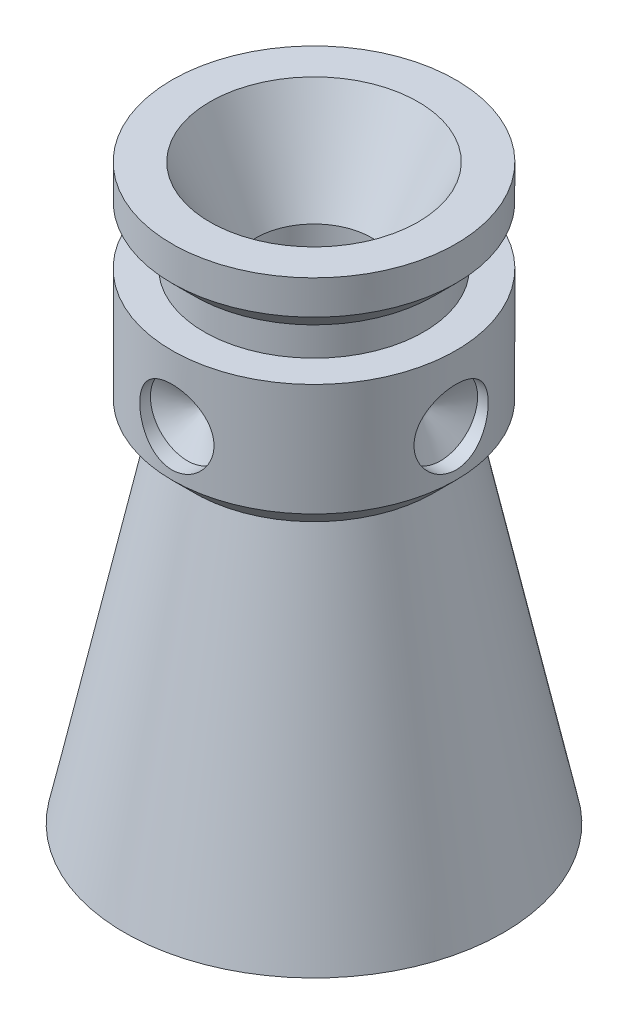
ISO-10303-21;
HEADER;
FILE_DESCRIPTION(('STEP AP214'),'2;1');
FILE_NAME('part.step','',(''),(''),'','','');
FILE_SCHEMA(('AUTOMOTIVE_DESIGN { 1 0 10303 214 1 1 1 1 }'));
ENDSEC;
DATA;
#1=APPLICATION_CONTEXT('core data for automotive mechanical design processes');
#2=APPLICATION_PROTOCOL_DEFINITION('international standard','automotive_design',2000,#1);
#3=PRODUCT_CONTEXT('',#1,'mechanical');
#4=PRODUCT('Part','Part','',(#3));
#5=PRODUCT_RELATED_PRODUCT_CATEGORY('part','',(#4));
#6=PRODUCT_DEFINITION_FORMATION('','',#4);
#7=PRODUCT_DEFINITION_CONTEXT('part definition',#1,'design');
#8=PRODUCT_DEFINITION('design','',#6,#7);
#9=PRODUCT_DEFINITION_SHAPE('','',#8);
#10=(LENGTH_UNIT() NAMED_UNIT(*) SI_UNIT(.MILLI.,.METRE.));
#11=(NAMED_UNIT(*) PLANE_ANGLE_UNIT() SI_UNIT($,.RADIAN.));
#12=(NAMED_UNIT(*) SI_UNIT($,.STERADIAN.) SOLID_ANGLE_UNIT());
#13=UNCERTAINTY_MEASURE_WITH_UNIT(LENGTH_MEASURE(1.E-05),#10,'distance_accuracy_value','');
#14=(GEOMETRIC_REPRESENTATION_CONTEXT(3) GLOBAL_UNCERTAINTY_ASSIGNED_CONTEXT((#13)) GLOBAL_UNIT_ASSIGNED_CONTEXT((#10,
#11,#12)) REPRESENTATION_CONTEXT('',''));
#15=CARTESIAN_POINT('',(0.,0.,0.));
#16=DIRECTION('',(0.,0.,1.));
#17=DIRECTION('',(1.,0.,0.));
#18=AXIS2_PLACEMENT_3D('',#15,#16,#17);
#19=CARTESIAN_POINT('',(0.,-38.4162585670867,0.));
#20=DIRECTION('',(0.,-1.,0.));
#21=DIRECTION('',(1.,0.,0.));
#22=AXIS2_PLACEMENT_3D('',#19,#20,#21);
#23=CONICAL_SURFACE('',#22,12.7,0.20943951023932);
#24=CARTESIAN_POINT('',(0.,-15.24,0.));
#25=DIRECTION('',(0.,1.,0.));
#26=DIRECTION('',(-1.,0.,0.));
#27=AXIS2_PLACEMENT_3D('',#24,#25,#26);
#28=CIRCLE('',#27,7.77373416660465);
#29=CARTESIAN_POINT('',(-7.77373416660464,-15.24,0.));
#30=VERTEX_POINT('',#29);
#31=EDGE_CURVE('E133',#30,#30,#28,.T.);
#32=ORIENTED_EDGE('',*,*,#31,.F.);
#33=EDGE_LOOP('',(#32));
#34=FACE_BOUND('',#33,.T.);
#35=CARTESIAN_POINT('',(0.,-38.4162585670867,0.));
#36=DIRECTION('',(0.,1.,0.));
#37=DIRECTION('',(-1.,0.,0.));
#38=AXIS2_PLACEMENT_3D('',#35,#36,#37);
#39=CIRCLE('',#38,12.7);
#40=CARTESIAN_POINT('',(-12.7,-38.4162585670867,0.));
#41=VERTEX_POINT('',#40);
#42=EDGE_CURVE('E97',#41,#41,#39,.T.);
#43=ORIENTED_EDGE('',*,*,#42,.T.);
#44=EDGE_LOOP('',(#43));
#45=FACE_BOUND('',#44,.T.);
#46=ADVANCED_FACE('F49',(#34,#45),#23,.T.);
#47=CARTESIAN_POINT('',(-9.525,-15.24,0.));
#48=DIRECTION('',(0.,-1.,0.));
#49=DIRECTION('',(1.,0.,0.));
#50=AXIS2_PLACEMENT_3D('',#47,#48,#49);
#51=PLANE('',#50);
#52=CARTESIAN_POINT('',(0.,-15.24,0.));
#53=DIRECTION('',(0.,-1.,0.));
#54=DIRECTION('',(1.,0.,0.));
#55=AXIS2_PLACEMENT_3D('',#52,#53,#54);
#56=CIRCLE('',#55,8.00100000000001);
#57=CARTESIAN_POINT('',(8.00100000000001,-15.24,0.));
#58=VERTEX_POINT('',#57);
#59=EDGE_CURVE('E11',#58,#58,#56,.T.);
#60=ORIENTED_EDGE('',*,*,#59,.T.);
#61=EDGE_LOOP('',(#60));
#62=FACE_BOUND('',#61,.T.);
#63=ORIENTED_EDGE('',*,*,#31,.T.);
#64=EDGE_LOOP('',(#63));
#65=FACE_BOUND('',#64,.T.);
#66=ADVANCED_FACE('F204',(#62,#65),#51,.T.);
#67=CARTESIAN_POINT('',(0.,0.,0.));
#68=DIRECTION('',(0.,1.,0.));
#69=DIRECTION('',(-1.,0.,0.));
#70=AXIS2_PLACEMENT_3D('',#67,#68,#69);
#71=CYLINDRICAL_SURFACE('',#70,9.525);
#72=CARTESIAN_POINT('',(0.,-13.716,0.));
#73=DIRECTION('',(0.,-1.,0.));
#74=DIRECTION('',(1.,0.,0.));
#75=AXIS2_PLACEMENT_3D('',#72,#73,#74);
#76=CIRCLE('',#75,9.525);
#77=CARTESIAN_POINT('',(9.525,-13.716,0.));
#78=VERTEX_POINT('',#77);
#79=EDGE_CURVE('E59',#78,#78,#76,.F.);
#80=ORIENTED_EDGE('',*,*,#79,.T.);
#81=EDGE_LOOP('',(#80));
#82=FACE_BOUND('',#81,.T.);
#83=CARTESIAN_POINT('',(0.,-8.14705,-9.525));
#84=CARTESIAN_POINT('',(0.137323103082611,-8.14705346250954,-9.52499783723789));
#85=CARTESIAN_POINT('',(0.274683803540827,-8.15845181421014,-9.5220009498425));
#86=CARTESIAN_POINT('',(0.545454817504591,-8.20366742460235,-9.51033660172161));
#87=CARTESIAN_POINT('',(0.67886308378735,-8.23749609643072,-9.5016662542199));
#88=CARTESIAN_POINT('',(0.937781085963373,-8.32640238967341,-9.47961298686465));
#89=CARTESIAN_POINT('',(1.06330054798976,-8.38145322380888,-9.46623600971754));
#90=CARTESIAN_POINT('',(1.3033244178594,-8.51114348594757,-9.4361867523065));
#91=CARTESIAN_POINT('',(1.41782820776366,-8.58578401198642,-9.4195142873378));
#92=CARTESIAN_POINT('',(1.63512889297054,-8.75429600345861,-9.38426082086036));
#93=CARTESIAN_POINT('',(1.73764457668024,-8.84852349924402,-9.36564822077701));
#94=CARTESIAN_POINT('',(1.92561282892677,-9.05277319317155,-9.32881740916716));
#95=CARTESIAN_POINT('',(2.01106329169342,-9.16279733767208,-9.31059924655944));
#96=CARTESIAN_POINT('',(2.16383071055916,-9.39774181400399,-9.27629835261263));
#97=CARTESIAN_POINT('',(2.23082707721048,-9.52287696828637,-9.26025557065469));
#98=CARTESIAN_POINT('',(2.34272067338952,-9.78312168765254,-9.23258523321777));
#99=CARTESIAN_POINT('',(2.38762179916945,-9.91822948933412,-9.22095689938222));
#100=CARTESIAN_POINT('',(2.45307933631136,-10.1914770354091,-9.20375782222117));
#101=CARTESIAN_POINT('',(2.47414423598979,-10.3294868283626,-9.19806076975411));
#102=CARTESIAN_POINT('',(2.49291619711201,-10.6071899793795,-9.19299169200256));
#103=CARTESIAN_POINT('',(2.49062743678671,-10.7468830318222,-9.19361853530219));
#104=CARTESIAN_POINT('',(2.46316139125304,-11.0200420753042,-9.20101321267126));
#105=CARTESIAN_POINT('',(2.4385963067538,-11.1535747727252,-9.20761678421622));
#106=CARTESIAN_POINT('',(2.36825416161704,-11.4145544703028,-9.22595825189206));
#107=CARTESIAN_POINT('',(2.32247546561091,-11.542001000438,-9.23769654385736));
#108=CARTESIAN_POINT('',(2.21049931131553,-11.7888013242712,-9.26513133930465));
#109=CARTESIAN_POINT('',(2.14408477190957,-11.9080517900867,-9.28086958419659));
#110=CARTESIAN_POINT('',(1.99287375773001,-12.1339320403078,-9.3145081781273));
#111=CARTESIAN_POINT('',(1.90807379459266,-12.2405594237253,-9.33240893718553));
#112=CARTESIAN_POINT('',(1.71935549947644,-12.4416679939605,-9.36904192109711));
#113=CARTESIAN_POINT('',(1.61492223677767,-12.5356650833044,-9.38778264192106));
#114=CARTESIAN_POINT('',(1.39154716027994,-12.7049085456204,-9.42348105210338));
#115=CARTESIAN_POINT('',(1.27260481883942,-12.7801542363704,-9.44043867657535));
#116=CARTESIAN_POINT('',(1.02285753194072,-12.9099604403721,-9.47075781345536));
#117=CARTESIAN_POINT('',(0.892006667710088,-12.9644362839706,-9.4841045429895));
#118=CARTESIAN_POINT('',(0.622576340980602,-13.0504792264986,-9.50559103973638));
#119=CARTESIAN_POINT('',(0.483998504873846,-13.0820511268522,-9.51373189822945));
#120=CARTESIAN_POINT('',(0.207181790414675,-13.1206366732083,-9.52372551919257));
#121=CARTESIAN_POINT('',(0.0690406504019545,-13.1283088332489,-9.52574684894956));
#122=CARTESIAN_POINT('',(-0.206553522498356,-13.1206916209605,-9.52375682466303));
#123=CARTESIAN_POINT('',(-0.344006622137163,-13.105404521141,-9.51974606767595));
#124=CARTESIAN_POINT('',(-0.611992843495863,-13.0528437807055,-9.50625112983042));
#125=CARTESIAN_POINT('',(-0.742602481309051,-13.0159348108457,-9.49685778683911));
#126=CARTESIAN_POINT('',(-0.995765664003257,-12.921599246109,-9.47366081959998));
#127=CARTESIAN_POINT('',(-1.11831835250662,-12.864170474332,-9.45985672744205));
#128=CARTESIAN_POINT('',(-1.35446761083772,-12.7291862397825,-9.42897158833701));
#129=CARTESIAN_POINT('',(-1.46784975366789,-12.6512690763301,-9.41183325863977));
#130=CARTESIAN_POINT('',(-1.68016170876929,-12.47797701266,-9.37626201051101));
#131=CARTESIAN_POINT('',(-1.77908877740739,-12.3825988059834,-9.35782884729528));
#132=CARTESIAN_POINT('',(-1.96243750984407,-12.1740237619052,-9.32112958624732));
#133=CARTESIAN_POINT('',(-2.04639538473104,-12.0604153361355,-9.30288143842935));
#134=CARTESIAN_POINT('',(-2.19406147593818,-11.8203392858555,-9.26916814207794));
#135=CARTESIAN_POINT('',(-2.25777056054574,-11.6938722130432,-9.25370287422432));
#136=CARTESIAN_POINT('',(-2.36265118577608,-11.4323187565009,-9.22748222731368));
#137=CARTESIAN_POINT('',(-2.40395474881774,-11.2972882183703,-9.21669933462822));
#138=CARTESIAN_POINT('',(-2.46317704329392,-11.0218706005702,-9.20105101956564));
#139=CARTESIAN_POINT('',(-2.48110146438283,-10.8814848327367,-9.19618415745602));
#140=CARTESIAN_POINT('',(-2.49273901435227,-10.6040804610931,-9.19303581636528));
#141=CARTESIAN_POINT('',(-2.48719617214082,-10.4670948899569,-9.19455195580681));
#142=CARTESIAN_POINT('',(-2.45377489753773,-10.1960846289559,-9.20352688304206));
#143=CARTESIAN_POINT('',(-2.42589699739048,-10.0620598686131,-9.21098552922583));
#144=CARTESIAN_POINT('',(-2.34902033016795,-9.80167048092011,-9.23088706684303));
#145=CARTESIAN_POINT('',(-2.30017331527834,-9.67525811885852,-9.24329410218948));
#146=CARTESIAN_POINT('',(-2.18286341446161,-9.43232889400443,-9.27169662672583));
#147=CARTESIAN_POINT('',(-2.11439756474054,-9.31581352979001,-9.28769265802176));
#148=CARTESIAN_POINT('',(-1.95751327505833,-9.09241986383358,-9.32203722009532));
#149=CARTESIAN_POINT('',(-1.86858430205785,-8.98590832246303,-9.34043957928606));
#150=CARTESIAN_POINT('',(-1.67427691298951,-8.7890781360722,-9.37721610731976));
#151=CARTESIAN_POINT('',(-1.56889453579223,-8.69876340168538,-9.39559026829556));
#152=CARTESIAN_POINT('',(-1.34209031499297,-8.5350930654667,-9.4306858326999));
#153=CARTESIAN_POINT('',(-1.22038631921262,-8.4621189133027,-9.44736611782222));
#154=CARTESIAN_POINT('',(-0.966008330572565,-8.3377817275923,-9.47675020280207));
#155=CARTESIAN_POINT('',(-0.833341718835406,-8.28640429258983,-9.48945665110272));
#156=CARTESIAN_POINT('',(-0.584234505728556,-8.21372433444825,-9.50774085392806));
#157=CARTESIAN_POINT('',(-0.468905884331781,-8.1887781940086,-9.51416676352708));
#158=CARTESIAN_POINT('',(-0.235727256829732,-8.1554402904039,-9.52279707363044));
#159=CARTESIAN_POINT('',(-0.11787748008066,-8.14704702779874,-9.52500185650442));
#160=CARTESIAN_POINT('',(0.,-8.14705,-9.525));
#161=B_SPLINE_CURVE_WITH_KNOTS('',3,(#83,#84,#85,#86,#87,#88,#89,#90,#91,#92,#93,#94,#95,#96,
#97,#98,#99,#100,#101,#102,#103,#104,#105,#106,#107,#108,#109,#110,#111,#112,#113,#114,#115,
#116,#117,#118,#119,#120,#121,#122,#123,#124,#125,#126,#127,#128,#129,#130,#131,#132,#133,#134,
#135,#136,#137,#138,#139,#140,#141,#142,#143,#144,#145,#146,#147,#148,#149,#150,#151,#152,#153,
#154,#155,#156,#157,#158,#159,#160),.UNSPECIFIED.,.T.,.F.,(4,2,2,2,2,2,2,2,2,2,2,2,2,2,2,2,2,2,
2,2,2,2,2,2,2,2,2,2,2,2,2,2,2,2,2,2,2,2,4),(0.,0.411537124086076,0.823283809942173,
1.23451246897799,1.64576418300573,2.06527303665935,2.48483362384433,2.91127935677485,
3.3376498637285,3.75474239790166,4.17176031086536,4.57765389535792,4.98357877561002,
5.3939273085032,5.80435376723681,6.22761479087187,6.65089121153722,7.07587515238809,
7.50076997678248,7.91384909905642,8.32688733741673,8.73315211841911,9.13946001194934,
9.55348832916931,9.96759512888818,10.3928833368936,10.8181533056749,11.2408894132325,
11.6635226225993,12.0728582894792,12.4821842021812,12.888596506494,13.2950702394256,
13.7130650910534,14.1311607298529,14.5577429292587,14.9840402155433,15.3373336746648,
15.6905951292776),.UNSPECIFIED.);
#162=CARTESIAN_POINT('',(0.,-8.14705,-9.525));
#163=VERTEX_POINT('',#162);
#164=EDGE_CURVE('E236',#163,#163,#161,.T.);
#165=ORIENTED_EDGE('',*,*,#164,.F.);
#166=EDGE_LOOP('',(#165));
#167=FACE_BOUND('',#166,.T.);
#168=CARTESIAN_POINT('',(9.1939930585138,-10.63625,-2.4892));
#169=CARTESIAN_POINT('',(9.19399552870129,-10.4990172064896,-2.48919648898829));
#170=CARTESIAN_POINT('',(9.19709921391146,-10.3617467193289,-2.47781260760029));
#171=CARTESIAN_POINT('',(9.20914325840779,-10.0911628047604,-2.43265967423897));
#172=CARTESIAN_POINT('',(9.2180866977956,-9.95785150438847,-2.39887880912603));
#173=CARTESIAN_POINT('',(9.24072972328114,-9.69913922249143,-2.31011220600244));
#174=CARTESIAN_POINT('',(9.25442279894374,-9.57372768919505,-2.25515548285163));
#175=CARTESIAN_POINT('',(9.28501399633689,-9.33388684916032,-2.12568728017065));
#176=CARTESIAN_POINT('',(9.30191233060071,-9.21945827143447,-2.05117450379813));
#177=CARTESIAN_POINT('',(9.33746488569584,-9.00208194053997,-1.88279544694344));
#178=CARTESIAN_POINT('',(9.35614924700049,-8.8994371239831,-1.78854436169849));
#179=CARTESIAN_POINT('',(9.39290802449355,-8.71121701222006,-1.58419212819884));
#180=CARTESIAN_POINT('',(9.41098237937225,-8.62564342856667,-1.47408939256944));
#181=CARTESIAN_POINT('',(9.4448200548614,-8.47273944380334,-1.23906691278797));
#182=CARTESIAN_POINT('',(9.46054366876872,-8.4057090463697,-1.11394577559574));
#183=CARTESIAN_POINT('',(9.48756304997316,-8.29374877423012,-0.853730973322959));
#184=CARTESIAN_POINT('',(9.49885953320611,-8.24881532580434,-0.718638924896151));
#185=CARTESIAN_POINT('',(9.51553873958128,-8.18330158158072,-0.445477858444613));
#186=CARTESIAN_POINT('',(9.52104634281158,-8.16220625269414,-0.307540121893573));
#187=CARTESIAN_POINT('',(9.52596338481239,-8.14334839607376,-0.0299808996484362));
#188=CARTESIAN_POINT('',(9.52537380535101,-8.14558211189871,0.109640311356406));
#189=CARTESIAN_POINT('',(9.51825488810874,-8.17295372239448,0.383022493246423));
#190=CARTESIAN_POINT('',(9.51186981605595,-8.19753534031999,0.516843487242441));
#191=CARTESIAN_POINT('',(9.49404684108449,-8.26800777041364,0.778390864202818));
#192=CARTESIAN_POINT('',(9.48260865596159,-8.31389977272283,0.906116906337275));
#193=CARTESIAN_POINT('',(9.45574848701095,-8.42612431753251,1.15328360048976));
#194=CARTESIAN_POINT('',(9.44028912184959,-8.49264985236637,1.27263239624403));
#195=CARTESIAN_POINT('',(9.40705597701912,-8.6441054954126,1.49866382293657));
#196=CARTESIAN_POINT('',(9.38928176208151,-8.72903906694596,1.60534406453606));
#197=CARTESIAN_POINT('',(9.35272965782988,-8.91786238726785,1.80632966657522));
#198=CARTESIAN_POINT('',(9.33393762880049,-9.022237635675,1.90017685393692));
#199=CARTESIAN_POINT('',(9.29794339542349,-9.24544006443913,2.06914418449754));
#200=CARTESIAN_POINT('',(9.28074128029033,-9.36426805491383,2.1442632772125));
#201=CARTESIAN_POINT('',(9.24981976563152,-9.61396530250581,2.2739725369567));
#202=CARTESIAN_POINT('',(9.23612084519338,-9.74489953366411,2.32844284907135));
#203=CARTESIAN_POINT('',(9.21401371883098,-10.014513573723,2.41445021535407));
#204=CARTESIAN_POINT('',(9.20560426037189,-10.1531915404464,2.44599269906515));
#205=CARTESIAN_POINT('',(9.19529377468776,-10.4300832437299,2.48446890749147));
#206=CARTESIAN_POINT('',(9.19321256413096,-10.5681956798631,2.49208412604674));
#207=CARTESIAN_POINT('',(9.19530205985316,-10.8437196612742,2.48436339436677));
#208=CARTESIAN_POINT('',(9.19947213051973,-10.9811312763841,2.46902977750385));
#209=CARTESIAN_POINT('',(9.21342072870801,-11.2487585035074,2.41644639420995));
#210=CARTESIAN_POINT('',(9.22309542063647,-11.3790597108454,2.37960206491897));
#211=CARTESIAN_POINT('',(9.24686265961522,-11.6316341875674,2.28549691935211));
#212=CARTESIAN_POINT('',(9.26095576645235,-11.753906437355,2.22823351597486));
#213=CARTESIAN_POINT('',(9.29234483383495,-11.9898152346155,2.09351823381813));
#214=CARTESIAN_POINT('',(9.30970240538211,-12.1032135150004,2.01566379239262));
#215=CARTESIAN_POINT('',(9.34551768410679,-12.3155863994845,1.84247868947466));
#216=CARTESIAN_POINT('',(9.3639755891836,-12.4145583978661,1.74714487781076));
#217=CARTESIAN_POINT('',(9.4005289582177,-12.5980758759022,1.53856299252336));
#218=CARTESIAN_POINT('',(9.41860032729626,-12.6821473442964,1.42489282285833));
#219=CARTESIAN_POINT('',(9.4518197830853,-12.8300132195346,1.1846559626573));
#220=CARTESIAN_POINT('',(9.46696802488382,-12.8938087022478,1.05808995686135));
#221=CARTESIAN_POINT('',(9.49253723684786,-12.9987352682017,0.79654247930262));
#222=CARTESIAN_POINT('',(9.50299305601375,-13.040033935294,0.661631808444863));
#223=CARTESIAN_POINT('',(9.51815246383632,-13.0992867352841,0.386472730461599));
#224=CARTESIAN_POINT('',(9.52285727307911,-13.1172458217922,0.246225462485606));
#225=CARTESIAN_POINT('',(9.52592946380866,-13.1290096022245,-0.0311893795590303));
#226=CARTESIAN_POINT('',(9.52447963449471,-13.1235109529248,-0.168325814881443));
#227=CARTESIAN_POINT('',(9.51581620160824,-13.0901257670901,-0.439649903556647));
#228=CARTESIAN_POINT('',(9.50860279934174,-13.0622400124759,-0.573837659730642));
#229=CARTESIAN_POINT('',(9.48925643419148,-12.9852596970075,-0.834652674204032));
#230=CARTESIAN_POINT('',(9.47715513152673,-12.9363014965123,-0.961322682879076));
#231=CARTESIAN_POINT('',(9.4493011621967,-12.8186882571102,-1.20472260068785));
#232=CARTESIAN_POINT('',(9.43354799961244,-12.7500305427273,-1.32145115683561));
#233=CARTESIAN_POINT('',(9.39957276437168,-12.5929003167014,-1.54491784927271));
#234=CARTESIAN_POINT('',(9.38129748649496,-12.5039623506825,-1.65132059855369));
#235=CARTESIAN_POINT('',(9.34456067713502,-12.3096858409434,-1.84792732739685));
#236=CARTESIAN_POINT('',(9.32609909849021,-12.2043430417625,-1.93812709074701));
#237=CARTESIAN_POINT('',(9.29063764267,-11.9775998635873,-2.10162746042206));
#238=CARTESIAN_POINT('',(9.27367634237283,-11.8559100884888,-2.17453581558654));
#239=CARTESIAN_POINT('',(9.24367179386211,-11.6015724358939,-2.29875357373361));
#240=CARTESIAN_POINT('',(9.2306258892442,-11.4689320660961,-2.35007763013551));
#241=CARTESIAN_POINT('',(9.21181556928546,-11.2199535665611,-2.42264769438016));
#242=CARTESIAN_POINT('',(9.20518494558353,-11.1047327808448,-2.44754760961514));
#243=CARTESIAN_POINT('',(9.1962728563407,-10.8717670746976,-2.48082441002936));
#244=CARTESIAN_POINT('',(9.19399093861268,-10.7540224179916,-2.48920301313067));
#245=CARTESIAN_POINT('',(9.1939930585138,-10.63625,-2.4892));
#246=B_SPLINE_CURVE_WITH_KNOTS('',3,(#168,#169,#170,#171,#172,#173,#174,#175,#176,#177,#178,
#179,#180,#181,#182,#183,#184,#185,#186,#187,#188,#189,#190,#191,#192,#193,#194,#195,#196,#197,
#198,#199,#200,#201,#202,#203,#204,#205,#206,#207,#208,#209,#210,#211,#212,#213,#214,#215,#216,
#217,#218,#219,#220,#221,#222,#223,#224,#225,#226,#227,#228,#229,#230,#231,#232,#233,#234,#235,
#236,#237,#238,#239,#240,#241,#242,#243,#244,#245),.UNSPECIFIED.,.T.,.F.,(4,2,2,2,2,2,2,2,2,2,2,
2,2,2,2,2,2,2,2,2,2,2,2,2,2,2,2,2,2,2,2,2,2,2,2,2,2,2,4),(0.,0.411265503021824,
0.822748098039148,1.23366887890855,1.64461691651366,2.06448051372898,2.48438618511356,
2.91073354063253,3.33701192067923,3.75389290452569,4.17070676325859,4.5774212748446,
4.98415850333055,5.39482105179851,5.80556093022763,6.22842369815393,6.6513101796865,
7.07661501201362,7.50181909498862,7.91479736950004,8.32773365640745,8.73312723549438,
9.13857219630171,9.55261951753272,9.96674153278343,10.3923026097525,10.8178411021443,
11.2401647368461,11.6623987226121,12.0721817221374,12.4819504096755,12.8891064242156,
13.2963177625638,13.7140334999915,14.1318577751272,14.5584076762802,14.9846675265822,
15.3376499933154,15.6905957542258),.UNSPECIFIED.);
#247=CARTESIAN_POINT('',(9.1939930585138,-10.63625,-2.4892));
#248=VERTEX_POINT('',#247);
#249=EDGE_CURVE('E242',#248,#248,#246,.T.);
#250=ORIENTED_EDGE('',*,*,#249,.F.);
#251=EDGE_LOOP('',(#250));
#252=FACE_BOUND('',#251,.T.);
#253=CARTESIAN_POINT('',(0.,-13.12545,9.525));
#254=CARTESIAN_POINT('',(0.137323103082612,-13.1254465374905,9.52499783723789));
#255=CARTESIAN_POINT('',(0.274683803540828,-13.1140481857899,9.5220009498425));
#256=CARTESIAN_POINT('',(0.545454817504594,-13.0688325753977,9.51033660172161));
#257=CARTESIAN_POINT('',(0.678863083787354,-13.0350039035693,9.5016662542199));
#258=CARTESIAN_POINT('',(0.937781085963381,-12.9460976103266,9.47961298686465));
#259=CARTESIAN_POINT('',(1.06330054798977,-12.8910467761912,9.46623600971754));
#260=CARTESIAN_POINT('',(1.30332441785942,-12.7613565140525,9.4361867523065));
#261=CARTESIAN_POINT('',(1.41782820776368,-12.6867159880137,9.41951428733779));
#262=CARTESIAN_POINT('',(1.63512889297057,-12.5182039965415,9.38426082086036));
#263=CARTESIAN_POINT('',(1.73764457668028,-12.4239765007561,9.36564822077701));
#264=CARTESIAN_POINT('',(1.92561282892681,-12.2197268068286,9.32881740916715));
#265=CARTESIAN_POINT('',(2.01106329169348,-12.109702662328,9.31059924655943));
#266=CARTESIAN_POINT('',(2.16383071055922,-11.8747581859961,9.27629835261262));
#267=CARTESIAN_POINT('',(2.23082707721056,-11.7496230317138,9.26025557065467));
#268=CARTESIAN_POINT('',(2.34272067338961,-11.4893783123476,9.23258523321775));
#269=CARTESIAN_POINT('',(2.38762179916954,-11.354270510666,9.2209568993822));
#270=CARTESIAN_POINT('',(2.45307933631147,-11.081022964591,9.20375782222114));
#271=CARTESIAN_POINT('',(2.4741442359899,-10.9430131716376,9.19806076975408));
#272=CARTESIAN_POINT('',(2.49291619711215,-10.6653100206207,9.19299169200253));
#273=CARTESIAN_POINT('',(2.49062743678686,-10.525616968178,9.19361853530215));
#274=CARTESIAN_POINT('',(2.46316139125319,-10.2524579246959,9.20101321267122));
#275=CARTESIAN_POINT('',(2.43859630675396,-10.118925227275,9.20761678421618));
#276=CARTESIAN_POINT('',(2.36825416161722,-9.85794552969729,9.22595825189202));
#277=CARTESIAN_POINT('',(2.32247546561109,-9.73049899956211,9.23769654385731));
#278=CARTESIAN_POINT('',(2.21049931131572,-9.48369867572892,9.2651313393046));
#279=CARTESIAN_POINT('',(2.14408477190978,-9.3644482099134,9.28086958419654));
#280=CARTESIAN_POINT('',(1.99287375773023,-9.13856795969233,9.31450817812725));
#281=CARTESIAN_POINT('',(1.90807379459288,-9.03194057627478,9.33240893718549));
#282=CARTESIAN_POINT('',(1.71935549947668,-8.83083200603956,9.36904192109706));
#283=CARTESIAN_POINT('',(1.61492223677792,-8.73683491669565,9.38778264192102));
#284=CARTESIAN_POINT('',(1.3915471602802,-8.56759145437968,9.42348105210335));
#285=CARTESIAN_POINT('',(1.27260481883968,-8.49234576362967,9.44043867657531));
#286=CARTESIAN_POINT('',(1.02285753194099,-8.36253955962798,9.47075781345533));
#287=CARTESIAN_POINT('',(0.892006667710361,-8.30806371602943,9.48410454298948));
#288=CARTESIAN_POINT('',(0.622576340980878,-8.22202077350143,9.50559103973636));
#289=CARTESIAN_POINT('',(0.483998504874125,-8.19044887314785,9.51373189822943));
#290=CARTESIAN_POINT('',(0.207181790414953,-8.15186332679174,9.52372551919256));
#291=CARTESIAN_POINT('',(0.0690406504022322,-8.14419116675113,9.52574684894956));
#292=CARTESIAN_POINT('',(-0.206553522498081,-8.15180837903954,9.52375682466304));
#293=CARTESIAN_POINT('',(-0.344006622136891,-8.16709547885897,9.51974606767596));
#294=CARTESIAN_POINT('',(-0.611992843495595,-8.21965621929447,9.50625112983044));
#295=CARTESIAN_POINT('',(-0.742602481308785,-8.25656518915427,9.49685778683913));
#296=CARTESIAN_POINT('',(-0.995765664002996,-8.35090075389098,9.47366081960001));
#297=CARTESIAN_POINT('',(-1.11831835250637,-8.40832952566793,9.45985672744208));
#298=CARTESIAN_POINT('',(-1.35446761083747,-8.54331376021741,9.42897158833704));
#299=CARTESIAN_POINT('',(-1.46784975366765,-8.62123092366986,9.4118332586398));
#300=CARTESIAN_POINT('',(-1.68016170876906,-8.79452298733993,9.37626201051105));
#301=CARTESIAN_POINT('',(-1.77908877740716,-8.88990119401648,9.35782884729533));
#302=CARTESIAN_POINT('',(-1.96243750984385,-9.0984762380947,9.32112958624737));
#303=CARTESIAN_POINT('',(-2.04639538473082,-9.21208466386438,9.3028814384294));
#304=CARTESIAN_POINT('',(-2.19406147593797,-9.45216071414441,9.26916814207799));
#305=CARTESIAN_POINT('',(-2.25777056054554,-9.57862778695671,9.25370287422437));
#306=CARTESIAN_POINT('',(-2.36265118577589,-9.84018124349896,9.22748222731373));
#307=CARTESIAN_POINT('',(-2.40395474881757,-9.97521178162955,9.21669933462827));
#308=CARTESIAN_POINT('',(-2.46317704329376,-10.2506293994297,9.20105101956568));
#309=CARTESIAN_POINT('',(-2.48110146438268,-10.3910151672631,9.19618415745606));
#310=CARTESIAN_POINT('',(-2.49273901435214,-10.6684195389067,9.19303581636531));
#311=CARTESIAN_POINT('',(-2.48719617214069,-10.805405110043,9.19455195580684));
#312=CARTESIAN_POINT('',(-2.45377489753762,-11.076415371044,9.20352688304209));
#313=CARTESIAN_POINT('',(-2.42589699739038,-11.2104401313867,9.21098552922586));
#314=CARTESIAN_POINT('',(-2.34902033016786,-11.4708295190798,9.23088706684305));
#315=CARTESIAN_POINT('',(-2.30017331527826,-11.5972418811413,9.2432941021895));
#316=CARTESIAN_POINT('',(-2.18286341446154,-11.8401711059954,9.27169662672584));
#317=CARTESIAN_POINT('',(-2.11439756474048,-11.9566864702099,9.28769265802177));
#318=CARTESIAN_POINT('',(-1.95751327505827,-12.1800801361663,9.32203722009534));
#319=CARTESIAN_POINT('',(-1.86858430205781,-12.2865916775369,9.34043957928607));
#320=CARTESIAN_POINT('',(-1.67427691298948,-12.4834218639277,9.37721610731976));
#321=CARTESIAN_POINT('',(-1.5688945357922,-12.5737365983145,9.39559026829556));
#322=CARTESIAN_POINT('',(-1.34209031499295,-12.7374069345332,9.4306858326999));
#323=CARTESIAN_POINT('',(-1.22038631921261,-12.8103810866972,9.44736611782223));
#324=CARTESIAN_POINT('',(-0.966008330572556,-12.9347182724076,9.47675020280207));
#325=CARTESIAN_POINT('',(-0.8333417188354,-12.9860957074101,9.48945665110272));
#326=CARTESIAN_POINT('',(-0.584234505728554,-13.0587756655517,9.50774085392806));
#327=CARTESIAN_POINT('',(-0.468905884331781,-13.0837218059914,9.51416676352708));
#328=CARTESIAN_POINT('',(-0.235727256829733,-13.1170597095961,9.52279707363044));
#329=CARTESIAN_POINT('',(-0.117877480080661,-13.1254529722012,9.52500185650442));
#330=CARTESIAN_POINT('',(0.,-13.12545,9.525));
#331=B_SPLINE_CURVE_WITH_KNOTS('',3,(#253,#254,#255,#256,#257,#258,#259,#260,#261,#262,#263,
#264,#265,#266,#267,#268,#269,#270,#271,#272,#273,#274,#275,#276,#277,#278,#279,#280,#281,#282,
#283,#284,#285,#286,#287,#288,#289,#290,#291,#292,#293,#294,#295,#296,#297,#298,#299,#300,#301,
#302,#303,#304,#305,#306,#307,#308,#309,#310,#311,#312,#313,#314,#315,#316,#317,#318,#319,#320,
#321,#322,#323,#324,#325,#326,#327,#328,#329,#330),.UNSPECIFIED.,.T.,.F.,(4,2,2,2,2,2,2,2,2,2,2,
2,2,2,2,2,2,2,2,2,2,2,2,2,2,2,2,2,2,2,2,2,2,2,2,2,2,2,4),(0.,0.411537124086075,
0.823283809942172,1.23451246897799,1.64576418300572,2.06527303665934,2.48483362384432,
2.91127935677485,3.3376498637285,3.75474239790166,4.17176031086537,4.57765389535792,
4.98357877561002,5.3939273085032,5.80435376723681,6.22761479087187,6.65089121153721,
7.07587515238808,7.50076997678248,7.91384909905642,8.32688733741674,8.73315211841911,
9.13946001194935,9.55348832916932,9.96759512888818,10.3928833368936,10.8181533056749,
11.2408894132325,11.6635226225993,12.0728582894792,12.4821842021812,12.888596506494,
13.2950702394256,13.7130650910534,14.1311607298529,14.5577429292587,14.9840402155433,
15.3373336746648,15.6905951292776),.UNSPECIFIED.);
#332=CARTESIAN_POINT('',(0.,-13.12545,9.525));
#333=VERTEX_POINT('',#332);
#334=EDGE_CURVE('E146',#333,#333,#331,.T.);
#335=ORIENTED_EDGE('',*,*,#334,.F.);
#336=EDGE_LOOP('',(#335));
#337=FACE_BOUND('',#336,.T.);
#338=CARTESIAN_POINT('',(-9.525,-13.12545,0.));
#339=CARTESIAN_POINT('',(-9.52499783723788,-13.1254465374905,0.13732310308261));
#340=CARTESIAN_POINT('',(-9.52200094984249,-13.1140481857899,0.274683803540827));
#341=CARTESIAN_POINT('',(-9.51033660172161,-13.0688325753977,0.545454817504593));
#342=CARTESIAN_POINT('',(-9.5016662542199,-13.0350039035693,0.678863083787352));
#343=CARTESIAN_POINT('',(-9.47961298686464,-12.9460976103266,0.937781085963378));
#344=CARTESIAN_POINT('',(-9.46623600971754,-12.8910467761912,1.06330054798977));
#345=CARTESIAN_POINT('',(-9.4361867523065,-12.7613565140525,1.30332441785941));
#346=CARTESIAN_POINT('',(-9.41951428733779,-12.6867159880136,1.41782820776368));
#347=CARTESIAN_POINT('',(-9.38426082086036,-12.5182039965415,1.63512889297057));
#348=CARTESIAN_POINT('',(-9.36564822077701,-12.4239765007561,1.73764457668027));
#349=CARTESIAN_POINT('',(-9.32881740916715,-12.2197268068285,1.9256128289268));
#350=CARTESIAN_POINT('',(-9.31059924655943,-12.109702662328,2.01106329169346));
#351=CARTESIAN_POINT('',(-9.27629835261262,-11.8747581859961,2.16383071055921));
#352=CARTESIAN_POINT('',(-9.26025557065467,-11.7496230317137,2.23082707721054));
#353=CARTESIAN_POINT('',(-9.23258523321775,-11.4893783123476,2.34272067338958));
#354=CARTESIAN_POINT('',(-9.2209568993822,-11.354270510666,2.38762179916952));
#355=CARTESIAN_POINT('',(-9.20375782222114,-11.081022964591,2.45307933631144));
#356=CARTESIAN_POINT('',(-9.19806076975408,-10.9430131716375,2.47414423598987));
#357=CARTESIAN_POINT('',(-9.19299169200253,-10.6653100206206,2.49291619711211));
#358=CARTESIAN_POINT('',(-9.19361853530216,-10.5256169681779,2.49062743678682));
#359=CARTESIAN_POINT('',(-9.20101321267123,-10.2524579246959,2.46316139125316));
#360=CARTESIAN_POINT('',(-9.20761678421619,-10.1189252272749,2.43859630675392));
#361=CARTESIAN_POINT('',(-9.22595825189203,-9.85794552969726,2.36825416161717));
#362=CARTESIAN_POINT('',(-9.23769654385733,-9.73049899956208,2.32247546561105));
#363=CARTESIAN_POINT('',(-9.26513133930461,-9.48369867572889,2.21049931131568));
#364=CARTESIAN_POINT('',(-9.28086958419655,-9.36444820991337,2.14408477190973));
#365=CARTESIAN_POINT('',(-9.31450817812726,-9.1385679596923,1.99287375773017));
#366=CARTESIAN_POINT('',(-9.3324089371855,-9.03194057627476,1.90807379459283));
#367=CARTESIAN_POINT('',(-9.36904192109707,-8.83083200603954,1.71935549947662));
#368=CARTESIAN_POINT('',(-9.38778264192103,-8.73683491669563,1.61492223677786));
#369=CARTESIAN_POINT('',(-9.42348105210335,-8.56759145437967,1.39154716028013));
#370=CARTESIAN_POINT('',(-9.44043867657532,-8.49234576362965,1.27260481883961));
#371=CARTESIAN_POINT('',(-9.47075781345533,-8.36253955962797,1.02285753194093));
#372=CARTESIAN_POINT('',(-9.48410454298948,-8.30806371602942,0.892006667710292));
#373=CARTESIAN_POINT('',(-9.50559103973636,-8.22202077350143,0.622576340980809));
#374=CARTESIAN_POINT('',(-9.51373189822943,-8.19044887314785,0.483998504874054));
#375=CARTESIAN_POINT('',(-9.52372551919256,-8.15186332679174,0.207181790414883));
#376=CARTESIAN_POINT('',(-9.52574684894956,-8.14419116675113,0.0690406504021618));
#377=CARTESIAN_POINT('',(-9.52375682466304,-8.15180837903954,-0.206553522498151));
#378=CARTESIAN_POINT('',(-9.51974606767595,-8.16709547885898,-0.344006622136959));
#379=CARTESIAN_POINT('',(-9.50625112983044,-8.21965621929448,-0.611992843495662));
#380=CARTESIAN_POINT('',(-9.49685778683913,-8.25656518915428,-0.742602481308852));
#381=CARTESIAN_POINT('',(-9.4736608196,-8.35090075389099,-0.995765664003062));
#382=CARTESIAN_POINT('',(-9.45985672744207,-8.40832952566795,-1.11831835250643));
#383=CARTESIAN_POINT('',(-9.42897158833703,-8.54331376021743,-1.35446761083753));
#384=CARTESIAN_POINT('',(-9.41183325863979,-8.62123092366989,-1.46784975366771));
#385=CARTESIAN_POINT('',(-9.37626201051103,-8.79452298733996,-1.68016170876912));
#386=CARTESIAN_POINT('',(-9.35782884729531,-8.88990119401651,-1.77908877740722));
#387=CARTESIAN_POINT('',(-9.32112958624736,-9.09847623809473,-1.9624375098439));
#388=CARTESIAN_POINT('',(-9.30288143842938,-9.21208466386441,-2.04639538473088));
#389=CARTESIAN_POINT('',(-9.26916814207798,-9.45216071414444,-2.19406147593803));
#390=CARTESIAN_POINT('',(-9.25370287422435,-9.57862778695674,-2.25777056054559));
#391=CARTESIAN_POINT('',(-9.22748222731372,-9.840181243499,-2.36265118577594));
#392=CARTESIAN_POINT('',(-9.21669933462825,-9.97521178162959,-2.40395474881762));
#393=CARTESIAN_POINT('',(-9.20105101956567,-10.2506293994297,-2.4631770432938));
#394=CARTESIAN_POINT('',(-9.19618415745605,-10.3910151672632,-2.48110146438272));
#395=CARTESIAN_POINT('',(-9.1930358163653,-10.6684195389068,-2.49273901435218));
#396=CARTESIAN_POINT('',(-9.19455195580683,-10.805405110043,-2.48719617214073));
#397=CARTESIAN_POINT('',(-9.20352688304208,-11.076415371044,-2.45377489753765));
#398=CARTESIAN_POINT('',(-9.21098552922585,-11.2104401313868,-2.42589699739041));
#399=CARTESIAN_POINT('',(-9.23088706684304,-11.4708295190798,-2.34902033016789));
#400=CARTESIAN_POINT('',(-9.24329410218949,-11.5972418811414,-2.30017331527828));
#401=CARTESIAN_POINT('',(-9.27169662672584,-11.8401711059955,-2.18286341446156));
#402=CARTESIAN_POINT('',(-9.28769265802177,-11.9566864702099,-2.1143975647405));
#403=CARTESIAN_POINT('',(-9.32203722009533,-12.1800801361663,-1.95751327505829));
#404=CARTESIAN_POINT('',(-9.34043957928606,-12.2865916775369,-1.86858430205782));
#405=CARTESIAN_POINT('',(-9.37721610731976,-12.4834218639277,-1.67427691298949));
#406=CARTESIAN_POINT('',(-9.39559026829556,-12.5737365983146,-1.56889453579221));
#407=CARTESIAN_POINT('',(-9.4306858326999,-12.7374069345332,-1.34209031499296));
#408=CARTESIAN_POINT('',(-9.44736611782222,-12.8103810866973,-1.22038631921261));
#409=CARTESIAN_POINT('',(-9.47675020280207,-12.9347182724077,-0.966008330572558));
#410=CARTESIAN_POINT('',(-9.48945665110271,-12.9860957074101,-0.833341718835402));
#411=CARTESIAN_POINT('',(-9.50774085392806,-13.0587756655517,-0.584234505728555));
#412=CARTESIAN_POINT('',(-9.51416676352708,-13.0837218059914,-0.468905884331782));
#413=CARTESIAN_POINT('',(-9.52279707363044,-13.1170597095961,-0.235727256829734));
#414=CARTESIAN_POINT('',(-9.52500185650442,-13.1254529722013,-0.117877480080662));
#415=CARTESIAN_POINT('',(-9.525,-13.12545,0.));
#416=B_SPLINE_CURVE_WITH_KNOTS('',3,(#338,#339,#340,#341,#342,#343,#344,#345,#346,#347,#348,
#349,#350,#351,#352,#353,#354,#355,#356,#357,#358,#359,#360,#361,#362,#363,#364,#365,#366,#367,
#368,#369,#370,#371,#372,#373,#374,#375,#376,#377,#378,#379,#380,#381,#382,#383,#384,#385,#386,
#387,#388,#389,#390,#391,#392,#393,#394,#395,#396,#397,#398,#399,#400,#401,#402,#403,#404,#405,
#406,#407,#408,#409,#410,#411,#412,#413,#414,#415),.UNSPECIFIED.,.T.,.F.,(4,2,2,2,2,2,2,2,2,2,2,
2,2,2,2,2,2,2,2,2,2,2,2,2,2,2,2,2,2,2,2,2,2,2,2,2,2,2,4),(0.,0.411537124086076,
0.823283809942172,1.23451246897799,1.64576418300572,2.06527303665935,2.48483362384433,
2.91127935677485,3.3376498637285,3.75474239790167,4.17176031086537,4.57765389535792,
4.98357877561003,5.3939273085032,5.80435376723681,6.22761479087187,6.65089121153721,
7.07587515238808,7.50076997678248,7.91384909905642,8.32688733741674,8.73315211841911,
9.13946001194934,9.55348832916931,9.96759512888818,10.3928833368936,10.8181533056749,
11.2408894132325,11.6635226225992,12.0728582894792,12.4821842021812,12.888596506494,
13.2950702394256,13.7130650910534,14.1311607298529,14.5577429292587,14.9840402155433,
15.3373336746648,15.6905951292776),.UNSPECIFIED.);
#417=CARTESIAN_POINT('',(-9.525,-13.12545,0.));
#418=VERTEX_POINT('',#417);
#419=EDGE_CURVE('E137',#418,#418,#416,.T.);
#420=ORIENTED_EDGE('',*,*,#419,.F.);
#421=EDGE_LOOP('',(#420));
#422=FACE_BOUND('',#421,.T.);
#423=CARTESIAN_POINT('',(0.,-6.19125,0.));
#424=DIRECTION('',(0.,1.,0.));
#425=DIRECTION('',(-1.,0.,0.));
#426=AXIS2_PLACEMENT_3D('',#423,#424,#425);
#427=CIRCLE('',#426,9.525);
#428=CARTESIAN_POINT('',(-9.525,-6.19125,0.));
#429=VERTEX_POINT('',#428);
#430=EDGE_CURVE('E129',#429,#429,#427,.T.);
#431=ORIENTED_EDGE('',*,*,#430,.F.);
#432=EDGE_LOOP('',(#431));
#433=FACE_BOUND('',#432,.T.);
#434=ADVANCED_FACE('F152',(#82,#167,#252,#337,#422,#433),#71,.T.);
#435=CARTESIAN_POINT('',(-7.366,-6.19125,0.));
#436=DIRECTION('',(0.,1.,0.));
#437=DIRECTION('',(-1.,0.,0.));
#438=AXIS2_PLACEMENT_3D('',#435,#436,#437);
#439=PLANE('',#438);
#440=ORIENTED_EDGE('',*,*,#430,.T.);
#441=EDGE_LOOP('',(#440));
#442=FACE_BOUND('',#441,.T.);
#443=CARTESIAN_POINT('',(0.,-6.19125,0.));
#444=DIRECTION('',(0.,1.,0.));
#445=DIRECTION('',(-1.,0.,0.));
#446=AXIS2_PLACEMENT_3D('',#443,#444,#445);
#447=CIRCLE('',#446,7.366);
#448=CARTESIAN_POINT('',(-7.366,-6.19125,0.));
#449=VERTEX_POINT('',#448);
#450=EDGE_CURVE('E125',#449,#449,#447,.T.);
#451=ORIENTED_EDGE('',*,*,#450,.F.);
#452=EDGE_LOOP('',(#451));
#453=FACE_BOUND('',#452,.T.);
#454=ADVANCED_FACE('F196',(#442,#453),#439,.T.);
#455=CARTESIAN_POINT('',(0.,0.,0.));
#456=DIRECTION('',(0.,1.,0.));
#457=DIRECTION('',(-1.,0.,0.));
#458=AXIS2_PLACEMENT_3D('',#455,#456,#457);
#459=CYLINDRICAL_SURFACE('',#458,7.366);
#460=ORIENTED_EDGE('',*,*,#450,.T.);
#461=EDGE_LOOP('',(#460));
#462=FACE_BOUND('',#461,.T.);
#463=CARTESIAN_POINT('',(0.,-3.81,0.));
#464=DIRECTION('',(0.,1.,0.));
#465=DIRECTION('',(-1.,0.,0.));
#466=AXIS2_PLACEMENT_3D('',#463,#464,#465);
#467=CIRCLE('',#466,7.366);
#468=CARTESIAN_POINT('',(-7.366,-3.81,0.));
#469=VERTEX_POINT('',#468);
#470=EDGE_CURVE('E121',#469,#469,#467,.T.);
#471=ORIENTED_EDGE('',*,*,#470,.F.);
#472=EDGE_LOOP('',(#471));
#473=FACE_BOUND('',#472,.T.);
#474=ADVANCED_FACE('F193',(#462,#473),#459,.T.);
#475=CARTESIAN_POINT('',(-9.525,-3.81,0.));
#476=DIRECTION('',(0.,-1.,0.));
#477=DIRECTION('',(1.,0.,0.));
#478=AXIS2_PLACEMENT_3D('',#475,#476,#477);
#479=PLANE('',#478);
#480=CARTESIAN_POINT('',(0.,-3.81,0.));
#481=DIRECTION('',(0.,-1.,0.));
#482=DIRECTION('',(1.,0.,0.));
#483=AXIS2_PLACEMENT_3D('',#480,#481,#482);
#484=CIRCLE('',#483,8.001);
#485=CARTESIAN_POINT('',(8.001,-3.81,0.));
#486=VERTEX_POINT('',#485);
#487=EDGE_CURVE('E231',#486,#486,#484,.T.);
#488=ORIENTED_EDGE('',*,*,#487,.T.);
#489=EDGE_LOOP('',(#488));
#490=FACE_BOUND('',#489,.T.);
#491=ORIENTED_EDGE('',*,*,#470,.T.);
#492=EDGE_LOOP('',(#491));
#493=FACE_BOUND('',#492,.T.);
#494=ADVANCED_FACE('F189',(#490,#493),#479,.T.);
#495=CARTESIAN_POINT('',(0.,0.,0.));
#496=DIRECTION('',(0.,1.,0.));
#497=DIRECTION('',(-1.,0.,0.));
#498=AXIS2_PLACEMENT_3D('',#495,#496,#497);
#499=CYLINDRICAL_SURFACE('',#498,9.525);
#500=CARTESIAN_POINT('',(0.,-2.28600000000001,0.));
#501=DIRECTION('',(0.,-1.,0.));
#502=DIRECTION('',(1.,0.,0.));
#503=AXIS2_PLACEMENT_3D('',#500,#501,#502);
#504=CIRCLE('',#503,9.525);
#505=CARTESIAN_POINT('',(9.525,-2.28600000000001,0.));
#506=VERTEX_POINT('',#505);
#507=EDGE_CURVE('E234',#506,#506,#504,.F.);
#508=ORIENTED_EDGE('',*,*,#507,.T.);
#509=EDGE_LOOP('',(#508));
#510=FACE_BOUND('',#509,.T.);
#511=CARTESIAN_POINT('',(0.,0.,0.));
#512=DIRECTION('',(0.,1.,0.));
#513=DIRECTION('',(-1.,0.,0.));
#514=AXIS2_PLACEMENT_3D('',#511,#512,#513);
#515=CIRCLE('',#514,9.525);
#516=CARTESIAN_POINT('',(-9.525,0.,0.));
#517=VERTEX_POINT('',#516);
#518=EDGE_CURVE('E117',#517,#517,#515,.T.);
#519=ORIENTED_EDGE('',*,*,#518,.F.);
#520=EDGE_LOOP('',(#519));
#521=FACE_BOUND('',#520,.T.);
#522=ADVANCED_FACE('F185',(#510,#521),#499,.T.);
#523=CARTESIAN_POINT('',(-6.985,0.,0.));
#524=DIRECTION('',(0.,1.,0.));
#525=DIRECTION('',(-1.,0.,0.));
#526=AXIS2_PLACEMENT_3D('',#523,#524,#525);
#527=PLANE('',#526);
#528=ORIENTED_EDGE('',*,*,#518,.T.);
#529=EDGE_LOOP('',(#528));
#530=FACE_BOUND('',#529,.T.);
#531=CARTESIAN_POINT('',(0.,0.,0.));
#532=DIRECTION('',(0.,1.,0.));
#533=DIRECTION('',(-1.,0.,0.));
#534=AXIS2_PLACEMENT_3D('',#531,#532,#533);
#535=CIRCLE('',#534,6.985);
#536=CARTESIAN_POINT('',(-6.985,0.,0.));
#537=VERTEX_POINT('',#536);
#538=EDGE_CURVE('E113',#537,#537,#535,.T.);
#539=ORIENTED_EDGE('',*,*,#538,.F.);
#540=EDGE_LOOP('',(#539));
#541=FACE_BOUND('',#540,.T.);
#542=ADVANCED_FACE('F181',(#530,#541),#527,.T.);
#543=CARTESIAN_POINT('',(0.,0.,0.));
#544=DIRECTION('',(0.,1.,0.));
#545=DIRECTION('',(-1.,0.,0.));
#546=AXIS2_PLACEMENT_3D('',#543,#544,#545);
#547=CONICAL_SURFACE('',#546,6.985,0.454281387106424);
#548=CARTESIAN_POINT('',(0.,-6.35,0.));
#549=DIRECTION('',(0.,1.,0.));
#550=DIRECTION('',(-1.,0.,0.));
#551=AXIS2_PLACEMENT_3D('',#548,#549,#550);
#552=CIRCLE('',#551,3.884);
#553=CARTESIAN_POINT('',(-3.884,-6.35,0.));
#554=VERTEX_POINT('',#553);
#555=EDGE_CURVE('E109',#554,#554,#552,.T.);
#556=ORIENTED_EDGE('',*,*,#555,.F.);
#557=EDGE_LOOP('',(#556));
#558=FACE_BOUND('',#557,.T.);
#559=ORIENTED_EDGE('',*,*,#538,.T.);
#560=EDGE_LOOP('',(#559));
#561=FACE_BOUND('',#560,.T.);
#562=ADVANCED_FACE('F177',(#558,#561),#547,.F.);
#563=CARTESIAN_POINT('',(0.,0.,0.));
#564=DIRECTION('',(0.,1.,0.));
#565=DIRECTION('',(-1.,0.,0.));
#566=AXIS2_PLACEMENT_3D('',#563,#564,#565);
#567=CYLINDRICAL_SURFACE('',#566,3.884);
#568=ORIENTED_EDGE('',*,*,#555,.T.);
#569=EDGE_LOOP('',(#568));
#570=FACE_BOUND('',#569,.T.);
#571=CARTESIAN_POINT('',(0.,-8.89,0.));
#572=DIRECTION('',(0.,1.,0.));
#573=DIRECTION('',(-1.,0.,0.));
#574=AXIS2_PLACEMENT_3D('',#571,#572,#573);
#575=CIRCLE('',#574,3.884);
#576=CARTESIAN_POINT('',(-3.884,-8.89,0.));
#577=VERTEX_POINT('',#576);
#578=EDGE_CURVE('E105',#577,#577,#575,.T.);
#579=ORIENTED_EDGE('',*,*,#578,.F.);
#580=EDGE_LOOP('',(#579));
#581=FACE_BOUND('',#580,.T.);
#582=ADVANCED_FACE('F173',(#570,#581),#567,.F.);
#583=CARTESIAN_POINT('',(0.,-38.4162585670867,0.));
#584=DIRECTION('',(0.,-1.,0.));
#585=DIRECTION('',(1.,0.,0.));
#586=AXIS2_PLACEMENT_3D('',#583,#584,#585);
#587=CONICAL_SURFACE('',#586,10.16,0.20943951023932);
#588=ORIENTED_EDGE('',*,*,#578,.T.);
#589=EDGE_LOOP('',(#588));
#590=FACE_BOUND('',#589,.T.);
#591=CARTESIAN_POINT('',(0.,-38.4162585670867,0.));
#592=DIRECTION('',(0.,1.,0.));
#593=DIRECTION('',(-1.,0.,0.));
#594=AXIS2_PLACEMENT_3D('',#591,#592,#593);
#595=CIRCLE('',#594,10.16);
#596=CARTESIAN_POINT('',(-10.16,-38.4162585670867,0.));
#597=VERTEX_POINT('',#596);
#598=EDGE_CURVE('E101',#597,#597,#595,.T.);
#599=ORIENTED_EDGE('',*,*,#598,.F.);
#600=EDGE_LOOP('',(#599));
#601=FACE_BOUND('',#600,.T.);
#602=ADVANCED_FACE('F169',(#590,#601),#587,.F.);
#603=CARTESIAN_POINT('',(-12.7,-38.4162585670867,0.));
#604=DIRECTION('',(0.,-1.,0.));
#605=DIRECTION('',(1.,0.,0.));
#606=AXIS2_PLACEMENT_3D('',#603,#604,#605);
#607=PLANE('',#606);
#608=ORIENTED_EDGE('',*,*,#598,.T.);
#609=EDGE_LOOP('',(#608));
#610=FACE_BOUND('',#609,.T.);
#611=ORIENTED_EDGE('',*,*,#42,.F.);
#612=EDGE_LOOP('',(#611));
#613=FACE_BOUND('',#612,.T.);
#614=ADVANCED_FACE('F166',(#610,#613),#607,.T.);
#615=CARTESIAN_POINT('',(-8.48066225288341,-10.63625,0.));
#616=DIRECTION('',(-1.,0.,0.));
#617=DIRECTION('',(0.,0.,1.));
#618=AXIS2_PLACEMENT_3D('',#615,#616,#617);
#619=CONICAL_SURFACE('',#618,2.4892,1.02974425867665);
#620=CARTESIAN_POINT('',(-6.985,-10.63625,0.));
#621=VERTEX_POINT('',#620);
#622=VERTEX_LOOP('',#621);
#623=FACE_BOUND('',#622,.T.);
#624=CARTESIAN_POINT('',(-8.48066225288341,-10.63625,0.));
#625=DIRECTION('',(-1.,0.,0.));
#626=DIRECTION('',(0.,0.,1.));
#627=AXIS2_PLACEMENT_3D('',#624,#625,#626);
#628=CIRCLE('',#627,2.4892);
#629=CARTESIAN_POINT('',(-8.48066225288341,-10.63625,2.4892));
#630=VERTEX_POINT('',#629);
#631=EDGE_CURVE('E93',#630,#630,#628,.T.);
#632=ORIENTED_EDGE('',*,*,#631,.T.);
#633=EDGE_LOOP('',(#632));
#634=FACE_BOUND('',#633,.T.);
#635=ADVANCED_FACE('F162',(#623,#634),#619,.F.);
#636=CARTESIAN_POINT('',(-9.525,-10.63625,0.));
#637=DIRECTION('',(-1.,0.,0.));
#638=DIRECTION('',(0.,0.,1.));
#639=AXIS2_PLACEMENT_3D('',#636,#637,#638);
#640=CYLINDRICAL_SURFACE('',#639,2.4892);
#641=ORIENTED_EDGE('',*,*,#419,.T.);
#642=EDGE_LOOP('',(#641));
#643=FACE_BOUND('',#642,.T.);
#644=ORIENTED_EDGE('',*,*,#631,.F.);
#645=EDGE_LOOP('',(#644));
#646=FACE_BOUND('',#645,.T.);
#647=ADVANCED_FACE('F156',(#643,#646),#640,.F.);
#648=CARTESIAN_POINT('',(0.,-10.63625,8.48066225288341));
#649=DIRECTION('',(0.,0.,1.));
#650=DIRECTION('',(0.,-1.,0.));
#651=AXIS2_PLACEMENT_3D('',#648,#649,#650);
#652=CONICAL_SURFACE('',#651,2.4892,1.02974425867665);
#653=CARTESIAN_POINT('',(0.,-10.63625,6.985));
#654=VERTEX_POINT('',#653);
#655=VERTEX_LOOP('',#654);
#656=FACE_BOUND('',#655,.T.);
#657=CARTESIAN_POINT('',(0.,-10.63625,8.48066225288341));
#658=DIRECTION('',(0.,0.,1.));
#659=DIRECTION('',(0.,-1.,0.));
#660=AXIS2_PLACEMENT_3D('',#657,#658,#659);
#661=CIRCLE('',#660,2.4892);
#662=CARTESIAN_POINT('',(0.,-13.12545,8.48066225288341));
#663=VERTEX_POINT('',#662);
#664=EDGE_CURVE('E87',#663,#663,#661,.T.);
#665=ORIENTED_EDGE('',*,*,#664,.T.);
#666=EDGE_LOOP('',(#665));
#667=FACE_BOUND('',#666,.T.);
#668=ADVANCED_FACE('F161',(#656,#667),#652,.F.);
#669=CARTESIAN_POINT('',(0.,-10.63625,9.525));
#670=DIRECTION('',(0.,0.,1.));
#671=DIRECTION('',(0.,-1.,0.));
#672=AXIS2_PLACEMENT_3D('',#669,#670,#671);
#673=CYLINDRICAL_SURFACE('',#672,2.4892);
#674=ORIENTED_EDGE('',*,*,#334,.T.);
#675=EDGE_LOOP('',(#674));
#676=FACE_BOUND('',#675,.T.);
#677=ORIENTED_EDGE('',*,*,#664,.F.);
#678=EDGE_LOOP('',(#677));
#679=FACE_BOUND('',#678,.T.);
#680=ADVANCED_FACE('F279',(#676,#679),#673,.F.);
#681=CARTESIAN_POINT('',(8.48066225288341,-10.63625,0.));
#682=DIRECTION('',(1.,0.,0.));
#683=DIRECTION('',(0.,0.,-1.));
#684=AXIS2_PLACEMENT_3D('',#681,#682,#683);
#685=CONICAL_SURFACE('',#684,2.4892,1.02974425867665);
#686=CARTESIAN_POINT('',(6.985,-10.63625,0.));
#687=VERTEX_POINT('',#686);
#688=VERTEX_LOOP('',#687);
#689=FACE_BOUND('',#688,.T.);
#690=CARTESIAN_POINT('',(8.48066225288341,-10.63625,0.));
#691=DIRECTION('',(1.,0.,0.));
#692=DIRECTION('',(0.,0.,-1.));
#693=AXIS2_PLACEMENT_3D('',#690,#691,#692);
#694=CIRCLE('',#693,2.4892);
#695=CARTESIAN_POINT('',(8.48066225288341,-10.63625,-2.4892));
#696=VERTEX_POINT('',#695);
#697=EDGE_CURVE('E83',#696,#696,#694,.T.);
#698=ORIENTED_EDGE('',*,*,#697,.T.);
#699=EDGE_LOOP('',(#698));
#700=FACE_BOUND('',#699,.T.);
#701=ADVANCED_FACE('F277',(#689,#700),#685,.F.);
#702=CARTESIAN_POINT('',(9.525,-10.63625,0.));
#703=DIRECTION('',(1.,0.,0.));
#704=DIRECTION('',(0.,0.,-1.));
#705=AXIS2_PLACEMENT_3D('',#702,#703,#704);
#706=CYLINDRICAL_SURFACE('',#705,2.4892);
#707=ORIENTED_EDGE('',*,*,#249,.T.);
#708=EDGE_LOOP('',(#707));
#709=FACE_BOUND('',#708,.T.);
#710=ORIENTED_EDGE('',*,*,#697,.F.);
#711=EDGE_LOOP('',(#710));
#712=FACE_BOUND('',#711,.T.);
#713=ADVANCED_FACE('F76',(#709,#712),#706,.F.);
#714=CARTESIAN_POINT('',(0.,-10.63625,-8.48066225288341));
#715=DIRECTION('',(0.,0.,-1.));
#716=DIRECTION('',(0.,1.,0.));
#717=AXIS2_PLACEMENT_3D('',#714,#715,#716);
#718=CONICAL_SURFACE('',#717,2.4892,1.02974425867665);
#719=CARTESIAN_POINT('',(0.,-10.63625,-6.985));
#720=VERTEX_POINT('',#719);
#721=VERTEX_LOOP('',#720);
#722=FACE_BOUND('',#721,.T.);
#723=CARTESIAN_POINT('',(0.,-10.63625,-8.48066225288341));
#724=DIRECTION('',(0.,0.,-1.));
#725=DIRECTION('',(0.,1.,0.));
#726=AXIS2_PLACEMENT_3D('',#723,#724,#725);
#727=CIRCLE('',#726,2.4892);
#728=CARTESIAN_POINT('',(0.,-8.14705,-8.48066225288341));
#729=VERTEX_POINT('',#728);
#730=EDGE_CURVE('E80',#729,#729,#727,.T.);
#731=ORIENTED_EDGE('',*,*,#730,.T.);
#732=EDGE_LOOP('',(#731));
#733=FACE_BOUND('',#732,.T.);
#734=ADVANCED_FACE('F72',(#722,#733),#718,.F.);
#735=CARTESIAN_POINT('',(0.,-10.63625,-9.525));
#736=DIRECTION('',(0.,0.,-1.));
#737=DIRECTION('',(0.,1.,0.));
#738=AXIS2_PLACEMENT_3D('',#735,#736,#737);
#739=CYLINDRICAL_SURFACE('',#738,2.4892);
#740=ORIENTED_EDGE('',*,*,#164,.T.);
#741=EDGE_LOOP('',(#740));
#742=FACE_BOUND('',#741,.T.);
#743=ORIENTED_EDGE('',*,*,#730,.F.);
#744=EDGE_LOOP('',(#743));
#745=FACE_BOUND('',#744,.T.);
#746=ADVANCED_FACE('F75',(#742,#745),#739,.F.);
#747=CARTESIAN_POINT('',(0.,-2.28600000000001,0.));
#748=DIRECTION('',(0.,1.,0.));
#749=DIRECTION('',(-1.,0.,0.));
#750=AXIS2_PLACEMENT_3D('',#747,#748,#749);
#751=CONICAL_SURFACE('',#750,9.525,0.785398163397451);
#752=ORIENTED_EDGE('',*,*,#487,.F.);
#753=EDGE_LOOP('',(#752));
#754=FACE_BOUND('',#753,.T.);
#755=ORIENTED_EDGE('',*,*,#507,.F.);
#756=EDGE_LOOP('',(#755));
#757=FACE_BOUND('',#756,.T.);
#758=ADVANCED_FACE('F216',(#754,#757),#751,.T.);
#759=CARTESIAN_POINT('',(0.,-13.716,0.));
#760=DIRECTION('',(0.,1.,0.));
#761=DIRECTION('',(-1.,0.,0.));
#762=AXIS2_PLACEMENT_3D('',#759,#760,#761);
#763=CONICAL_SURFACE('',#762,9.525,0.785398163397451);
#764=ORIENTED_EDGE('',*,*,#59,.F.);
#765=EDGE_LOOP('',(#764));
#766=FACE_BOUND('',#765,.T.);
#767=ORIENTED_EDGE('',*,*,#79,.F.);
#768=EDGE_LOOP('',(#767));
#769=FACE_BOUND('',#768,.T.);
#770=ADVANCED_FACE('F52',(#766,#769),#763,.T.);
#771=CLOSED_SHELL('',(#46,#66,#434,#454,#474,#494,#522,#542,#562,#582,#602,#614,#635,#647,#668,
#680,#701,#713,#734,#746,#758,#770));
#772=MANIFOLD_SOLID_BREP('B2',#771);
#773=ADVANCED_BREP_SHAPE_REPRESENTATION('',(#18,#772),#14);
#774=SHAPE_DEFINITION_REPRESENTATION(#9,#773);
ENDSEC;
END-ISO-10303-21;
